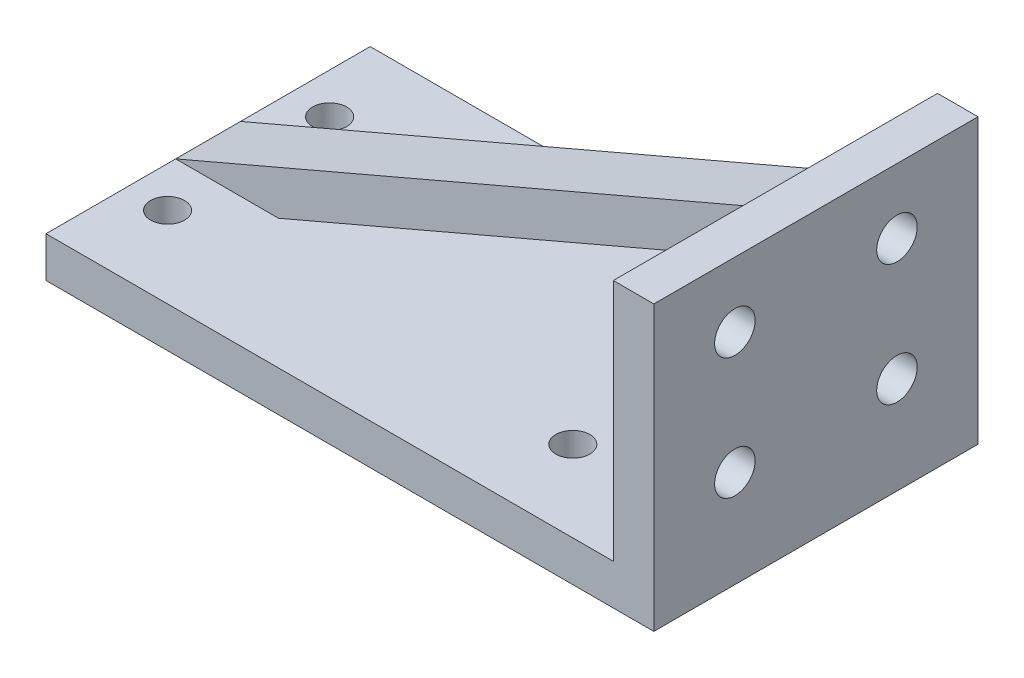
ISO-10303-21;
HEADER;
FILE_DESCRIPTION(('STEP AP214'),'2;1');
FILE_NAME('part.step','',(''),(''),'','','');
FILE_SCHEMA(('AUTOMOTIVE_DESIGN { 1 0 10303 214 1 1 1 1 }'));
ENDSEC;
DATA;
#1=APPLICATION_CONTEXT('core data for automotive mechanical design processes');
#2=APPLICATION_PROTOCOL_DEFINITION('international standard','automotive_design',2000,#1);
#3=PRODUCT_CONTEXT('',#1,'mechanical');
#4=PRODUCT('Part','Part','',(#3));
#5=PRODUCT_RELATED_PRODUCT_CATEGORY('part','',(#4));
#6=PRODUCT_DEFINITION_FORMATION('','',#4);
#7=PRODUCT_DEFINITION_CONTEXT('part definition',#1,'design');
#8=PRODUCT_DEFINITION('design','',#6,#7);
#9=PRODUCT_DEFINITION_SHAPE('','',#8);
#10=(LENGTH_UNIT() NAMED_UNIT(*) SI_UNIT(.MILLI.,.METRE.));
#11=(NAMED_UNIT(*) PLANE_ANGLE_UNIT() SI_UNIT($,.RADIAN.));
#12=(NAMED_UNIT(*) SI_UNIT($,.STERADIAN.) SOLID_ANGLE_UNIT());
#13=UNCERTAINTY_MEASURE_WITH_UNIT(LENGTH_MEASURE(1.E-05),#10,'distance_accuracy_value','');
#14=(GEOMETRIC_REPRESENTATION_CONTEXT(3) GLOBAL_UNCERTAINTY_ASSIGNED_CONTEXT((#13)) GLOBAL_UNIT_ASSIGNED_CONTEXT((#10,
#11,#12)) REPRESENTATION_CONTEXT('',''));
#15=CARTESIAN_POINT('',(0.,0.,0.));
#16=DIRECTION('',(0.,0.,1.));
#17=DIRECTION('',(1.,0.,0.));
#18=AXIS2_PLACEMENT_3D('',#15,#16,#17);
#19=CARTESIAN_POINT('',(-2.29913793103448,5.36465517241379,50.8));
#20=DIRECTION('',(-0.393919298579168,0.919145030018058,0.));
#21=DIRECTION('',(-0.919145030018058,-0.393919298579168,0.));
#22=AXIS2_PLACEMENT_3D('',#19,#20,#21);
#23=PLANE('',#22);
#24=DIRECTION('',(0.,0.,-1.));
#25=VECTOR('',#24,1.);
#26=CARTESIAN_POINT('',(88.9,44.45,50.8));
#27=LINE('',#26,#25);
#28=CARTESIAN_POINT('',(88.9,44.45,30.48));
#29=VERTEX_POINT('',#28);
#30=CARTESIAN_POINT('',(88.9,44.45,20.32));
#31=VERTEX_POINT('',#30);
#32=EDGE_CURVE('E111',#29,#31,#27,.T.);
#33=ORIENTED_EDGE('',*,*,#32,.T.);
#34=DIRECTION('',(-0.919145030018058,-0.393919298579168,0.));
#35=VECTOR('',#34,1.);
#36=CARTESIAN_POINT('',(-2.29913793103448,5.36465517241379,20.32));
#37=LINE('',#36,#35);
#38=CARTESIAN_POINT('',(0.,6.35,20.32));
#39=VERTEX_POINT('',#38);
#40=EDGE_CURVE('E194',#31,#39,#37,.T.);
#41=ORIENTED_EDGE('',*,*,#40,.T.);
#42=DIRECTION('',(0.,0.,-1.));
#43=VECTOR('',#42,1.);
#44=CARTESIAN_POINT('',(0.,6.35,50.8));
#45=LINE('',#44,#43);
#46=CARTESIAN_POINT('',(0.,6.35,30.48));
#47=VERTEX_POINT('',#46);
#48=EDGE_CURVE('E112',#47,#39,#45,.T.);
#49=ORIENTED_EDGE('',*,*,#48,.F.);
#50=DIRECTION('',(-0.919145030018058,-0.393919298579168,0.));
#51=VECTOR('',#50,1.);
#52=CARTESIAN_POINT('',(-2.29913793103448,5.36465517241379,30.48));
#53=LINE('',#52,#51);
#54=EDGE_CURVE('E207',#29,#47,#53,.T.);
#55=ORIENTED_EDGE('',*,*,#54,.F.);
#56=EDGE_LOOP('',(#33,#41,#49,#55));
#57=FACE_BOUND('',#56,.T.);
#58=ADVANCED_FACE('F35',(#57),#23,.T.);
#59=CARTESIAN_POINT('',(0.202249614943232,-0.471915768200874,50.8));
#60=DIRECTION('',(-0.393919298579168,0.919145030018058,0.));
#61=DIRECTION('',(-0.919145030018058,-0.393919298579168,0.));
#62=AXIS2_PLACEMENT_3D('',#59,#60,#61);
#63=PLANE('',#62);
#64=DIRECTION('',(-0.919145030018058,-0.393919298579168,0.));
#65=VECTOR('',#64,1.);
#66=CARTESIAN_POINT('',(0.202249614943232,-0.471915768200874,20.32));
#67=LINE('',#66,#65);
#68=CARTESIAN_POINT('',(88.9,37.5414058253949,20.32));
#69=VERTEX_POINT('',#68);
#70=CARTESIAN_POINT('',(16.1200530740786,6.35,20.32));
#71=VERTEX_POINT('',#70);
#72=EDGE_CURVE('E191',#69,#71,#67,.T.);
#73=ORIENTED_EDGE('',*,*,#72,.F.);
#74=DIRECTION('',(0.,0.,-1.));
#75=VECTOR('',#74,1.);
#76=CARTESIAN_POINT('',(88.9,37.5414058253949,50.8));
#77=LINE('',#76,#75);
#78=CARTESIAN_POINT('',(88.9,37.5414058253949,30.48));
#79=VERTEX_POINT('',#78);
#80=EDGE_CURVE('E147',#79,#69,#77,.T.);
#81=ORIENTED_EDGE('',*,*,#80,.F.);
#82=DIRECTION('',(-0.919145030018058,-0.393919298579168,0.));
#83=VECTOR('',#82,1.);
#84=CARTESIAN_POINT('',(0.202249614943232,-0.471915768200874,30.48));
#85=LINE('',#84,#83);
#86=CARTESIAN_POINT('',(16.1200530740786,6.35,30.48));
#87=VERTEX_POINT('',#86);
#88=EDGE_CURVE('E204',#79,#87,#85,.T.);
#89=ORIENTED_EDGE('',*,*,#88,.T.);
#90=DIRECTION('',(0.,0.,-1.));
#91=VECTOR('',#90,1.);
#92=CARTESIAN_POINT('',(16.1200530740786,6.35,50.8));
#93=LINE('',#92,#91);
#94=EDGE_CURVE('E142',#87,#71,#93,.T.);
#95=ORIENTED_EDGE('',*,*,#94,.T.);
#96=EDGE_LOOP('',(#73,#81,#89,#95));
#97=FACE_BOUND('',#96,.T.);
#98=ADVANCED_FACE('F259',(#97),#63,.F.);
#99=CARTESIAN_POINT('',(95.25,0.,50.8));
#100=DIRECTION('',(-1.,0.,0.));
#101=DIRECTION('',(0.,0.,1.));
#102=AXIS2_PLACEMENT_3D('',#99,#100,#101);
#103=PLANE('',#102);
#104=CARTESIAN_POINT('',(95.25,34.29,38.1));
#105=DIRECTION('',(1.,0.,0.));
#106=DIRECTION('',(0.,0.,-1.));
#107=AXIS2_PLACEMENT_3D('',#104,#105,#106);
#108=CIRCLE('',#107,3.175);
#109=CARTESIAN_POINT('',(95.25,34.29,34.925));
#110=VERTEX_POINT('',#109);
#111=EDGE_CURVE('E172',#110,#110,#108,.T.);
#112=ORIENTED_EDGE('',*,*,#111,.F.);
#113=EDGE_LOOP('',(#112));
#114=FACE_BOUND('',#113,.T.);
#115=CARTESIAN_POINT('',(95.25,34.29,12.7));
#116=DIRECTION('',(1.,0.,0.));
#117=DIRECTION('',(0.,0.,-1.));
#118=AXIS2_PLACEMENT_3D('',#115,#116,#117);
#119=CIRCLE('',#118,3.175);
#120=CARTESIAN_POINT('',(95.25,34.29,9.525));
#121=VERTEX_POINT('',#120);
#122=EDGE_CURVE('E162',#121,#121,#119,.T.);
#123=ORIENTED_EDGE('',*,*,#122,.F.);
#124=EDGE_LOOP('',(#123));
#125=FACE_BOUND('',#124,.T.);
#126=CARTESIAN_POINT('',(95.25,15.24,12.7));
#127=DIRECTION('',(1.,0.,0.));
#128=DIRECTION('',(0.,0.,-1.));
#129=AXIS2_PLACEMENT_3D('',#126,#127,#128);
#130=CIRCLE('',#129,3.175);
#131=CARTESIAN_POINT('',(95.25,15.24,9.525));
#132=VERTEX_POINT('',#131);
#133=EDGE_CURVE('E159',#132,#132,#130,.T.);
#134=ORIENTED_EDGE('',*,*,#133,.F.);
#135=EDGE_LOOP('',(#134));
#136=FACE_BOUND('',#135,.T.);
#137=CARTESIAN_POINT('',(95.25,15.24,38.1));
#138=DIRECTION('',(1.,0.,0.));
#139=DIRECTION('',(0.,0.,-1.));
#140=AXIS2_PLACEMENT_3D('',#137,#138,#139);
#141=CIRCLE('',#140,3.175);
#142=CARTESIAN_POINT('',(95.25,15.24,34.925));
#143=VERTEX_POINT('',#142);
#144=EDGE_CURVE('E156',#143,#143,#141,.T.);
#145=ORIENTED_EDGE('',*,*,#144,.F.);
#146=EDGE_LOOP('',(#145));
#147=FACE_BOUND('',#146,.T.);
#148=DIRECTION('',(0.,1.,0.));
#149=VECTOR('',#148,1.);
#150=CARTESIAN_POINT('',(95.25,0.,0.));
#151=LINE('',#150,#149);
#152=CARTESIAN_POINT('',(95.25,0.,0.));
#153=VERTEX_POINT('',#152);
#154=CARTESIAN_POINT('',(95.25,44.45,0.));
#155=VERTEX_POINT('',#154);
#156=EDGE_CURVE('E130',#153,#155,#151,.T.);
#157=ORIENTED_EDGE('',*,*,#156,.T.);
#158=DIRECTION('',(0.,0.,-1.));
#159=VECTOR('',#158,1.);
#160=CARTESIAN_POINT('',(95.25,44.45,50.8));
#161=LINE('',#160,#159);
#162=CARTESIAN_POINT('',(95.25,44.45,50.8));
#163=VERTEX_POINT('',#162);
#164=EDGE_CURVE('E11',#163,#155,#161,.T.);
#165=ORIENTED_EDGE('',*,*,#164,.F.);
#166=DIRECTION('',(0.,1.,0.));
#167=VECTOR('',#166,1.);
#168=CARTESIAN_POINT('',(95.25,0.,50.8));
#169=LINE('',#168,#167);
#170=CARTESIAN_POINT('',(95.25,0.,50.8));
#171=VERTEX_POINT('',#170);
#172=EDGE_CURVE('E119',#171,#163,#169,.T.);
#173=ORIENTED_EDGE('',*,*,#172,.F.);
#174=DIRECTION('',(0.,0.,-1.));
#175=VECTOR('',#174,1.);
#176=CARTESIAN_POINT('',(95.25,0.,50.8));
#177=LINE('',#176,#175);
#178=EDGE_CURVE('E140',#171,#153,#177,.T.);
#179=ORIENTED_EDGE('',*,*,#178,.T.);
#180=EDGE_LOOP('',(#157,#165,#173,#179));
#181=FACE_BOUND('',#180,.T.);
#182=ADVANCED_FACE('F232',(#114,#125,#136,#147,#181),#103,.F.);
#183=CARTESIAN_POINT('',(0.,44.45,50.8));
#184=DIRECTION('',(0.,-1.,0.));
#185=DIRECTION('',(0.,0.,-1.));
#186=AXIS2_PLACEMENT_3D('',#183,#184,#185);
#187=PLANE('',#186);
#188=DIRECTION('',(-1.,0.,0.));
#189=VECTOR('',#188,1.);
#190=CARTESIAN_POINT('',(0.,44.45,0.));
#191=LINE('',#190,#189);
#192=CARTESIAN_POINT('',(88.9,44.45,0.));
#193=VERTEX_POINT('',#192);
#194=EDGE_CURVE('E133',#155,#193,#191,.T.);
#195=ORIENTED_EDGE('',*,*,#194,.T.);
#196=DIRECTION('',(0.,0.,-1.));
#197=VECTOR('',#196,1.);
#198=CARTESIAN_POINT('',(88.9,44.45,20.32));
#199=LINE('',#198,#197);
#200=EDGE_CURVE('E183',#31,#193,#199,.T.);
#201=ORIENTED_EDGE('',*,*,#200,.F.);
#202=ORIENTED_EDGE('',*,*,#32,.F.);
#203=CARTESIAN_POINT('',(88.9,44.45,50.8));
#204=VERTEX_POINT('',#203);
#205=EDGE_CURVE('E45',#204,#29,#27,.T.);
#206=ORIENTED_EDGE('',*,*,#205,.F.);
#207=DIRECTION('',(-1.,0.,0.));
#208=VECTOR('',#207,1.);
#209=CARTESIAN_POINT('',(0.,44.45,50.8));
#210=LINE('',#209,#208);
#211=EDGE_CURVE('E116',#163,#204,#210,.T.);
#212=ORIENTED_EDGE('',*,*,#211,.F.);
#213=ORIENTED_EDGE('',*,*,#164,.T.);
#214=EDGE_LOOP('',(#195,#201,#202,#206,#212,#213));
#215=FACE_BOUND('',#214,.T.);
#216=ADVANCED_FACE('F235',(#215),#187,.F.);
#217=CARTESIAN_POINT('',(0.,0.,50.8));
#218=DIRECTION('',(-1.,0.,0.));
#219=DIRECTION('',(0.,0.,1.));
#220=AXIS2_PLACEMENT_3D('',#217,#218,#219);
#221=PLANE('',#220);
#222=DIRECTION('',(0.,1.,0.));
#223=VECTOR('',#222,1.);
#224=CARTESIAN_POINT('',(0.,0.,0.));
#225=LINE('',#224,#223);
#226=CARTESIAN_POINT('',(0.,0.,0.));
#227=VERTEX_POINT('',#226);
#228=CARTESIAN_POINT('',(0.,6.35,0.));
#229=VERTEX_POINT('',#228);
#230=EDGE_CURVE('E136',#227,#229,#225,.T.);
#231=ORIENTED_EDGE('',*,*,#230,.F.);
#232=DIRECTION('',(0.,0.,-1.));
#233=VECTOR('',#232,1.);
#234=CARTESIAN_POINT('',(0.,0.,50.8));
#235=LINE('',#234,#233);
#236=CARTESIAN_POINT('',(0.,0.,50.8));
#237=VERTEX_POINT('',#236);
#238=EDGE_CURVE('E71',#237,#227,#235,.T.);
#239=ORIENTED_EDGE('',*,*,#238,.F.);
#240=DIRECTION('',(0.,1.,0.));
#241=VECTOR('',#240,1.);
#242=CARTESIAN_POINT('',(0.,0.,50.8));
#243=LINE('',#242,#241);
#244=CARTESIAN_POINT('',(0.,6.35,50.8));
#245=VERTEX_POINT('',#244);
#246=EDGE_CURVE('E95',#237,#245,#243,.T.);
#247=ORIENTED_EDGE('',*,*,#246,.T.);
#248=EDGE_CURVE('E101',#245,#47,#45,.T.);
#249=ORIENTED_EDGE('',*,*,#248,.T.);
#250=ORIENTED_EDGE('',*,*,#48,.T.);
#251=DIRECTION('',(0.,0.,-1.));
#252=VECTOR('',#251,1.);
#253=CARTESIAN_POINT('',(0.,6.35,20.32));
#254=LINE('',#253,#252);
#255=EDGE_CURVE('E182',#39,#229,#254,.T.);
#256=ORIENTED_EDGE('',*,*,#255,.T.);
#257=EDGE_LOOP('',(#231,#239,#247,#249,#250,#256));
#258=FACE_BOUND('',#257,.T.);
#259=ADVANCED_FACE('F115',(#258),#221,.T.);
#260=CARTESIAN_POINT('',(0.,6.35,50.8));
#261=DIRECTION('',(0.,1.,0.));
#262=DIRECTION('',(-1.,0.,0.));
#263=AXIS2_PLACEMENT_3D('',#260,#261,#262);
#264=PLANE('',#263);
#265=DIRECTION('',(-1.,0.,0.));
#266=VECTOR('',#265,1.);
#267=CARTESIAN_POINT('',(88.9,6.35,20.32));
#268=LINE('',#267,#266);
#269=EDGE_CURVE('E179',#71,#39,#268,.T.);
#270=ORIENTED_EDGE('',*,*,#269,.F.);
#271=ORIENTED_EDGE('',*,*,#94,.F.);
#272=DIRECTION('',(1.,0.,0.));
#273=VECTOR('',#272,1.);
#274=CARTESIAN_POINT('',(0.,6.35,30.48));
#275=LINE('',#274,#273);
#276=EDGE_CURVE('E107',#47,#87,#275,.T.);
#277=ORIENTED_EDGE('',*,*,#276,.F.);
#278=ORIENTED_EDGE('',*,*,#248,.F.);
#279=DIRECTION('',(1.,0.,0.));
#280=VECTOR('',#279,1.);
#281=CARTESIAN_POINT('',(0.,6.35,50.8));
#282=LINE('',#281,#280);
#283=CARTESIAN_POINT('',(88.9,6.35,50.8));
#284=VERTEX_POINT('',#283);
#285=EDGE_CURVE('E90',#245,#284,#282,.T.);
#286=ORIENTED_EDGE('',*,*,#285,.T.);
#287=DIRECTION('',(0.,0.,-1.));
#288=VECTOR('',#287,1.);
#289=CARTESIAN_POINT('',(88.9,6.35,50.8));
#290=LINE('',#289,#288);
#291=CARTESIAN_POINT('',(88.9,6.35,0.));
#292=VERTEX_POINT('',#291);
#293=EDGE_CURVE('E82',#284,#292,#290,.T.);
#294=ORIENTED_EDGE('',*,*,#293,.T.);
#295=DIRECTION('',(1.,0.,0.));
#296=VECTOR('',#295,1.);
#297=CARTESIAN_POINT('',(0.,6.35,0.));
#298=LINE('',#297,#296);
#299=EDGE_CURVE('E123',#229,#292,#298,.T.);
#300=ORIENTED_EDGE('',*,*,#299,.F.);
#301=ORIENTED_EDGE('',*,*,#255,.F.);
#302=EDGE_LOOP('',(#270,#271,#277,#278,#286,#294,#300,#301));
#303=FACE_BOUND('',#302,.T.);
#304=CARTESIAN_POINT('',(69.85,6.35,12.7));
#305=DIRECTION('',(0.,1.,0.));
#306=DIRECTION('',(-1.,0.,0.));
#307=AXIS2_PLACEMENT_3D('',#304,#305,#306);
#308=CIRCLE('',#307,2.667);
#309=CARTESIAN_POINT('',(67.183,6.35,12.7));
#310=VERTEX_POINT('',#309);
#311=EDGE_CURVE('E219',#310,#310,#308,.T.);
#312=ORIENTED_EDGE('',*,*,#311,.F.);
#313=EDGE_LOOP('',(#312));
#314=FACE_BOUND('',#313,.T.);
#315=CARTESIAN_POINT('',(6.35,6.35,12.7));
#316=DIRECTION('',(0.,-1.,0.));
#317=DIRECTION('',(0.,0.,-1.));
#318=AXIS2_PLACEMENT_3D('',#315,#316,#317);
#319=CIRCLE('',#318,2.667);
#320=CARTESIAN_POINT('',(6.35,6.35,10.033));
#321=VERTEX_POINT('',#320);
#322=EDGE_CURVE('E186',#321,#321,#319,.F.);
#323=ORIENTED_EDGE('',*,*,#322,.F.);
#324=EDGE_LOOP('',(#323));
#325=FACE_BOUND('',#324,.T.);
#326=CARTESIAN_POINT('',(6.35,6.35,38.1));
#327=DIRECTION('',(0.,-1.,0.));
#328=DIRECTION('',(0.,0.,-1.));
#329=AXIS2_PLACEMENT_3D('',#326,#327,#328);
#330=CIRCLE('',#329,2.667);
#331=CARTESIAN_POINT('',(6.35,6.35,35.433));
#332=VERTEX_POINT('',#331);
#333=EDGE_CURVE('E201',#332,#332,#330,.F.);
#334=ORIENTED_EDGE('',*,*,#333,.F.);
#335=EDGE_LOOP('',(#334));
#336=FACE_BOUND('',#335,.T.);
#337=CARTESIAN_POINT('',(69.85,6.35,38.1));
#338=DIRECTION('',(0.,1.,0.));
#339=DIRECTION('',(-1.,0.,0.));
#340=AXIS2_PLACEMENT_3D('',#337,#338,#339);
#341=CIRCLE('',#340,2.667);
#342=CARTESIAN_POINT('',(67.183,6.35,38.1));
#343=VERTEX_POINT('',#342);
#344=EDGE_CURVE('E213',#343,#343,#341,.T.);
#345=ORIENTED_EDGE('',*,*,#344,.F.);
#346=EDGE_LOOP('',(#345));
#347=FACE_BOUND('',#346,.T.);
#348=ADVANCED_FACE('F37',(#303,#314,#325,#336,#347),#264,.T.);
#349=CARTESIAN_POINT('',(88.9,0.,50.8));
#350=DIRECTION('',(-1.,0.,0.));
#351=DIRECTION('',(0.,0.,1.));
#352=AXIS2_PLACEMENT_3D('',#349,#350,#351);
#353=PLANE('',#352);
#354=CARTESIAN_POINT('',(88.9,34.29,38.1));
#355=DIRECTION('',(-1.,0.,0.));
#356=DIRECTION('',(0.,0.,1.));
#357=AXIS2_PLACEMENT_3D('',#354,#355,#356);
#358=CIRCLE('',#357,3.175);
#359=CARTESIAN_POINT('',(88.9,34.29,41.275));
#360=VERTEX_POINT('',#359);
#361=EDGE_CURVE('E39',#360,#360,#358,.T.);
#362=ORIENTED_EDGE('',*,*,#361,.F.);
#363=EDGE_LOOP('',(#362));
#364=FACE_BOUND('',#363,.T.);
#365=CARTESIAN_POINT('',(88.9,34.29,12.7));
#366=DIRECTION('',(-1.,0.,0.));
#367=DIRECTION('',(0.,0.,1.));
#368=AXIS2_PLACEMENT_3D('',#365,#366,#367);
#369=CIRCLE('',#368,3.175);
#370=CARTESIAN_POINT('',(88.9,34.29,15.875));
#371=VERTEX_POINT('',#370);
#372=EDGE_CURVE('E160',#371,#371,#369,.T.);
#373=ORIENTED_EDGE('',*,*,#372,.F.);
#374=EDGE_LOOP('',(#373));
#375=FACE_BOUND('',#374,.T.);
#376=CARTESIAN_POINT('',(88.9,15.24,12.7));
#377=DIRECTION('',(-1.,0.,0.));
#378=DIRECTION('',(0.,0.,1.));
#379=AXIS2_PLACEMENT_3D('',#376,#377,#378);
#380=CIRCLE('',#379,3.175);
#381=CARTESIAN_POINT('',(88.9,15.24,15.875));
#382=VERTEX_POINT('',#381);
#383=EDGE_CURVE('E157',#382,#382,#380,.T.);
#384=ORIENTED_EDGE('',*,*,#383,.F.);
#385=EDGE_LOOP('',(#384));
#386=FACE_BOUND('',#385,.T.);
#387=CARTESIAN_POINT('',(88.9,15.24,38.1));
#388=DIRECTION('',(-1.,0.,0.));
#389=DIRECTION('',(0.,0.,1.));
#390=AXIS2_PLACEMENT_3D('',#387,#388,#389);
#391=CIRCLE('',#390,3.175);
#392=CARTESIAN_POINT('',(88.9,15.24,41.275));
#393=VERTEX_POINT('',#392);
#394=EDGE_CURVE('E152',#393,#393,#391,.T.);
#395=ORIENTED_EDGE('',*,*,#394,.F.);
#396=EDGE_LOOP('',(#395));
#397=FACE_BOUND('',#396,.T.);
#398=DIRECTION('',(0.,1.,0.));
#399=VECTOR('',#398,1.);
#400=CARTESIAN_POINT('',(88.9,0.,0.));
#401=LINE('',#400,#399);
#402=EDGE_CURVE('E126',#292,#193,#401,.T.);
#403=ORIENTED_EDGE('',*,*,#402,.F.);
#404=ORIENTED_EDGE('',*,*,#293,.F.);
#405=DIRECTION('',(0.,1.,0.));
#406=VECTOR('',#405,1.);
#407=CARTESIAN_POINT('',(88.9,0.,50.8));
#408=LINE('',#407,#406);
#409=EDGE_CURVE('E96',#284,#204,#408,.T.);
#410=ORIENTED_EDGE('',*,*,#409,.T.);
#411=ORIENTED_EDGE('',*,*,#205,.T.);
#412=DIRECTION('',(0.,1.,0.));
#413=VECTOR('',#412,1.);
#414=CARTESIAN_POINT('',(88.9,6.35,30.48));
#415=LINE('',#414,#413);
#416=EDGE_CURVE('E198',#79,#29,#415,.T.);
#417=ORIENTED_EDGE('',*,*,#416,.F.);
#418=ORIENTED_EDGE('',*,*,#80,.T.);
#419=DIRECTION('',(0.,-1.,0.));
#420=VECTOR('',#419,1.);
#421=CARTESIAN_POINT('',(88.9,44.45,20.32));
#422=LINE('',#421,#420);
#423=EDGE_CURVE('E155',#31,#69,#422,.T.);
#424=ORIENTED_EDGE('',*,*,#423,.F.);
#425=ORIENTED_EDGE('',*,*,#200,.T.);
#426=EDGE_LOOP('',(#403,#404,#410,#411,#417,#418,#424,#425));
#427=FACE_BOUND('',#426,.T.);
#428=ADVANCED_FACE('F245',(#364,#375,#386,#397,#427),#353,.T.);
#429=CARTESIAN_POINT('',(0.,0.,50.8));
#430=DIRECTION('',(0.,1.,0.));
#431=DIRECTION('',(0.,0.,1.));
#432=AXIS2_PLACEMENT_3D('',#429,#430,#431);
#433=PLANE('',#432);
#434=CARTESIAN_POINT('',(69.85,0.,38.1));
#435=DIRECTION('',(0.,-1.,0.));
#436=DIRECTION('',(0.,0.,-1.));
#437=AXIS2_PLACEMENT_3D('',#434,#435,#436);
#438=CIRCLE('',#437,2.667);
#439=CARTESIAN_POINT('',(69.85,0.,35.433));
#440=VERTEX_POINT('',#439);
#441=EDGE_CURVE('E210',#440,#440,#438,.T.);
#442=ORIENTED_EDGE('',*,*,#441,.F.);
#443=EDGE_LOOP('',(#442));
#444=FACE_BOUND('',#443,.T.);
#445=CARTESIAN_POINT('',(69.85,0.,12.7));
#446=DIRECTION('',(0.,-1.,0.));
#447=DIRECTION('',(0.,0.,-1.));
#448=AXIS2_PLACEMENT_3D('',#445,#446,#447);
#449=CIRCLE('',#448,2.667);
#450=CARTESIAN_POINT('',(69.85,0.,10.033));
#451=VERTEX_POINT('',#450);
#452=EDGE_CURVE('E216',#451,#451,#449,.T.);
#453=ORIENTED_EDGE('',*,*,#452,.F.);
#454=EDGE_LOOP('',(#453));
#455=FACE_BOUND('',#454,.T.);
#456=CARTESIAN_POINT('',(6.35,0.,12.7));
#457=DIRECTION('',(0.,-1.,0.));
#458=DIRECTION('',(0.,0.,-1.));
#459=AXIS2_PLACEMENT_3D('',#456,#457,#458);
#460=CIRCLE('',#459,2.667);
#461=CARTESIAN_POINT('',(6.35,0.,10.033));
#462=VERTEX_POINT('',#461);
#463=EDGE_CURVE('E222',#462,#462,#460,.T.);
#464=ORIENTED_EDGE('',*,*,#463,.F.);
#465=EDGE_LOOP('',(#464));
#466=FACE_BOUND('',#465,.T.);
#467=CARTESIAN_POINT('',(6.35,0.,38.1));
#468=DIRECTION('',(0.,-1.,0.));
#469=DIRECTION('',(0.,0.,-1.));
#470=AXIS2_PLACEMENT_3D('',#467,#468,#469);
#471=CIRCLE('',#470,2.667);
#472=CARTESIAN_POINT('',(6.35,0.,35.433));
#473=VERTEX_POINT('',#472);
#474=EDGE_CURVE('E127',#473,#473,#471,.T.);
#475=ORIENTED_EDGE('',*,*,#474,.F.);
#476=EDGE_LOOP('',(#475));
#477=FACE_BOUND('',#476,.T.);
#478=DIRECTION('',(1.,0.,0.));
#479=VECTOR('',#478,1.);
#480=CARTESIAN_POINT('',(0.,0.,0.));
#481=LINE('',#480,#479);
#482=EDGE_CURVE('E74',#227,#153,#481,.T.);
#483=ORIENTED_EDGE('',*,*,#482,.T.);
#484=ORIENTED_EDGE('',*,*,#178,.F.);
#485=DIRECTION('',(1.,0.,0.));
#486=VECTOR('',#485,1.);
#487=CARTESIAN_POINT('',(0.,0.,50.8));
#488=LINE('',#487,#486);
#489=EDGE_CURVE('E54',#237,#171,#488,.T.);
#490=ORIENTED_EDGE('',*,*,#489,.F.);
#491=ORIENTED_EDGE('',*,*,#238,.T.);
#492=EDGE_LOOP('',(#483,#484,#490,#491));
#493=FACE_BOUND('',#492,.T.);
#494=ADVANCED_FACE('F285',(#444,#455,#466,#477,#493),#433,.F.);
#495=CARTESIAN_POINT('',(0.,0.,50.8));
#496=DIRECTION('',(0.,0.,1.));
#497=DIRECTION('',(1.,0.,0.));
#498=AXIS2_PLACEMENT_3D('',#495,#496,#497);
#499=PLANE('',#498);
#500=ORIENTED_EDGE('',*,*,#211,.T.);
#501=ORIENTED_EDGE('',*,*,#409,.F.);
#502=ORIENTED_EDGE('',*,*,#285,.F.);
#503=ORIENTED_EDGE('',*,*,#246,.F.);
#504=ORIENTED_EDGE('',*,*,#489,.T.);
#505=ORIENTED_EDGE('',*,*,#172,.T.);
#506=EDGE_LOOP('',(#500,#501,#502,#503,#504,#505));
#507=FACE_BOUND('',#506,.T.);
#508=ADVANCED_FACE('F93',(#507),#499,.T.);
#509=CARTESIAN_POINT('',(0.,0.,0.));
#510=DIRECTION('',(0.,0.,1.));
#511=DIRECTION('',(1.,0.,0.));
#512=AXIS2_PLACEMENT_3D('',#509,#510,#511);
#513=PLANE('',#512);
#514=ORIENTED_EDGE('',*,*,#402,.T.);
#515=ORIENTED_EDGE('',*,*,#194,.F.);
#516=ORIENTED_EDGE('',*,*,#156,.F.);
#517=ORIENTED_EDGE('',*,*,#482,.F.);
#518=ORIENTED_EDGE('',*,*,#230,.T.);
#519=ORIENTED_EDGE('',*,*,#299,.T.);
#520=EDGE_LOOP('',(#514,#515,#516,#517,#518,#519));
#521=FACE_BOUND('',#520,.T.);
#522=ADVANCED_FACE('F274',(#521),#513,.F.);
#523=CARTESIAN_POINT('',(6.35,44.45,38.1));
#524=DIRECTION('',(0.,-1.,0.));
#525=DIRECTION('',(0.,0.,-1.));
#526=AXIS2_PLACEMENT_3D('',#523,#524,#525);
#527=CYLINDRICAL_SURFACE('',#526,2.667);
#528=ORIENTED_EDGE('',*,*,#333,.T.);
#529=EDGE_LOOP('',(#528));
#530=FACE_BOUND('',#529,.T.);
#531=ORIENTED_EDGE('',*,*,#474,.T.);
#532=EDGE_LOOP('',(#531));
#533=FACE_BOUND('',#532,.T.);
#534=ADVANCED_FACE('F276',(#530,#533),#527,.F.);
#535=CARTESIAN_POINT('',(6.35,44.45,12.7));
#536=DIRECTION('',(0.,-1.,0.));
#537=DIRECTION('',(0.,0.,-1.));
#538=AXIS2_PLACEMENT_3D('',#535,#536,#537);
#539=CYLINDRICAL_SURFACE('',#538,2.667);
#540=ORIENTED_EDGE('',*,*,#322,.T.);
#541=EDGE_LOOP('',(#540));
#542=FACE_BOUND('',#541,.T.);
#543=ORIENTED_EDGE('',*,*,#463,.T.);
#544=EDGE_LOOP('',(#543));
#545=FACE_BOUND('',#544,.T.);
#546=ADVANCED_FACE('F282',(#542,#545),#539,.F.);
#547=CARTESIAN_POINT('',(69.85,44.45,12.7));
#548=DIRECTION('',(0.,-1.,0.));
#549=DIRECTION('',(0.,0.,-1.));
#550=AXIS2_PLACEMENT_3D('',#547,#548,#549);
#551=CYLINDRICAL_SURFACE('',#550,2.667);
#552=ORIENTED_EDGE('',*,*,#311,.T.);
#553=EDGE_LOOP('',(#552));
#554=FACE_BOUND('',#553,.T.);
#555=ORIENTED_EDGE('',*,*,#452,.T.);
#556=EDGE_LOOP('',(#555));
#557=FACE_BOUND('',#556,.T.);
#558=ADVANCED_FACE('F336',(#554,#557),#551,.F.);
#559=CARTESIAN_POINT('',(69.85,44.45,38.1));
#560=DIRECTION('',(0.,-1.,0.));
#561=DIRECTION('',(0.,0.,-1.));
#562=AXIS2_PLACEMENT_3D('',#559,#560,#561);
#563=CYLINDRICAL_SURFACE('',#562,2.667);
#564=ORIENTED_EDGE('',*,*,#344,.T.);
#565=EDGE_LOOP('',(#564));
#566=FACE_BOUND('',#565,.T.);
#567=ORIENTED_EDGE('',*,*,#441,.T.);
#568=EDGE_LOOP('',(#567));
#569=FACE_BOUND('',#568,.T.);
#570=ADVANCED_FACE('F333',(#566,#569),#563,.F.);
#571=CARTESIAN_POINT('',(0.,0.,30.48));
#572=DIRECTION('',(0.,0.,-1.));
#573=DIRECTION('',(-1.,0.,0.));
#574=AXIS2_PLACEMENT_3D('',#571,#572,#573);
#575=PLANE('',#574);
#576=ORIENTED_EDGE('',*,*,#54,.T.);
#577=ORIENTED_EDGE('',*,*,#276,.T.);
#578=ORIENTED_EDGE('',*,*,#88,.F.);
#579=ORIENTED_EDGE('',*,*,#416,.T.);
#580=EDGE_LOOP('',(#576,#577,#578,#579));
#581=FACE_BOUND('',#580,.T.);
#582=ADVANCED_FACE('F252',(#581),#575,.F.);
#583=CARTESIAN_POINT('',(0.,0.,20.32));
#584=DIRECTION('',(0.,0.,-1.));
#585=DIRECTION('',(-1.,0.,0.));
#586=AXIS2_PLACEMENT_3D('',#583,#584,#585);
#587=PLANE('',#586);
#588=ORIENTED_EDGE('',*,*,#423,.T.);
#589=ORIENTED_EDGE('',*,*,#72,.T.);
#590=ORIENTED_EDGE('',*,*,#269,.T.);
#591=ORIENTED_EDGE('',*,*,#40,.F.);
#592=EDGE_LOOP('',(#588,#589,#590,#591));
#593=FACE_BOUND('',#592,.T.);
#594=ADVANCED_FACE('F266',(#593),#587,.T.);
#595=CARTESIAN_POINT('',(0.,15.24,38.1));
#596=DIRECTION('',(1.,0.,0.));
#597=DIRECTION('',(0.,0.,-1.));
#598=AXIS2_PLACEMENT_3D('',#595,#596,#597);
#599=CYLINDRICAL_SURFACE('',#598,3.175);
#600=ORIENTED_EDGE('',*,*,#394,.T.);
#601=EDGE_LOOP('',(#600));
#602=FACE_BOUND('',#601,.T.);
#603=ORIENTED_EDGE('',*,*,#144,.T.);
#604=EDGE_LOOP('',(#603));
#605=FACE_BOUND('',#604,.T.);
#606=ADVANCED_FACE('F314',(#602,#605),#599,.F.);
#607=CARTESIAN_POINT('',(0.,15.24,12.7));
#608=DIRECTION('',(1.,0.,0.));
#609=DIRECTION('',(0.,0.,-1.));
#610=AXIS2_PLACEMENT_3D('',#607,#608,#609);
#611=CYLINDRICAL_SURFACE('',#610,3.175);
#612=ORIENTED_EDGE('',*,*,#383,.T.);
#613=EDGE_LOOP('',(#612));
#614=FACE_BOUND('',#613,.T.);
#615=ORIENTED_EDGE('',*,*,#133,.T.);
#616=EDGE_LOOP('',(#615));
#617=FACE_BOUND('',#616,.T.);
#618=ADVANCED_FACE('F317',(#614,#617),#611,.F.);
#619=CARTESIAN_POINT('',(0.,34.29,12.7));
#620=DIRECTION('',(1.,0.,0.));
#621=DIRECTION('',(0.,0.,-1.));
#622=AXIS2_PLACEMENT_3D('',#619,#620,#621);
#623=CYLINDRICAL_SURFACE('',#622,3.175);
#624=ORIENTED_EDGE('',*,*,#372,.T.);
#625=EDGE_LOOP('',(#624));
#626=FACE_BOUND('',#625,.T.);
#627=ORIENTED_EDGE('',*,*,#122,.T.);
#628=EDGE_LOOP('',(#627));
#629=FACE_BOUND('',#628,.T.);
#630=ADVANCED_FACE('F325',(#626,#629),#623,.F.);
#631=CARTESIAN_POINT('',(0.,34.29,38.1));
#632=DIRECTION('',(1.,0.,0.));
#633=DIRECTION('',(0.,0.,-1.));
#634=AXIS2_PLACEMENT_3D('',#631,#632,#633);
#635=CYLINDRICAL_SURFACE('',#634,3.175);
#636=ORIENTED_EDGE('',*,*,#361,.T.);
#637=EDGE_LOOP('',(#636));
#638=FACE_BOUND('',#637,.T.);
#639=ORIENTED_EDGE('',*,*,#111,.T.);
#640=EDGE_LOOP('',(#639));
#641=FACE_BOUND('',#640,.T.);
#642=ADVANCED_FACE('F415',(#638,#641),#635,.F.);
#643=CLOSED_SHELL('',(#58,#98,#182,#216,#259,#348,#428,#494,#508,#522,#534,#546,#558,#570,#582,
#594,#606,#618,#630,#642));
#644=MANIFOLD_SOLID_BREP('B2',#643);
#645=ADVANCED_BREP_SHAPE_REPRESENTATION('',(#18,#644),#14);
#646=SHAPE_DEFINITION_REPRESENTATION(#9,#645);
ENDSEC;
END-ISO-10303-21;
